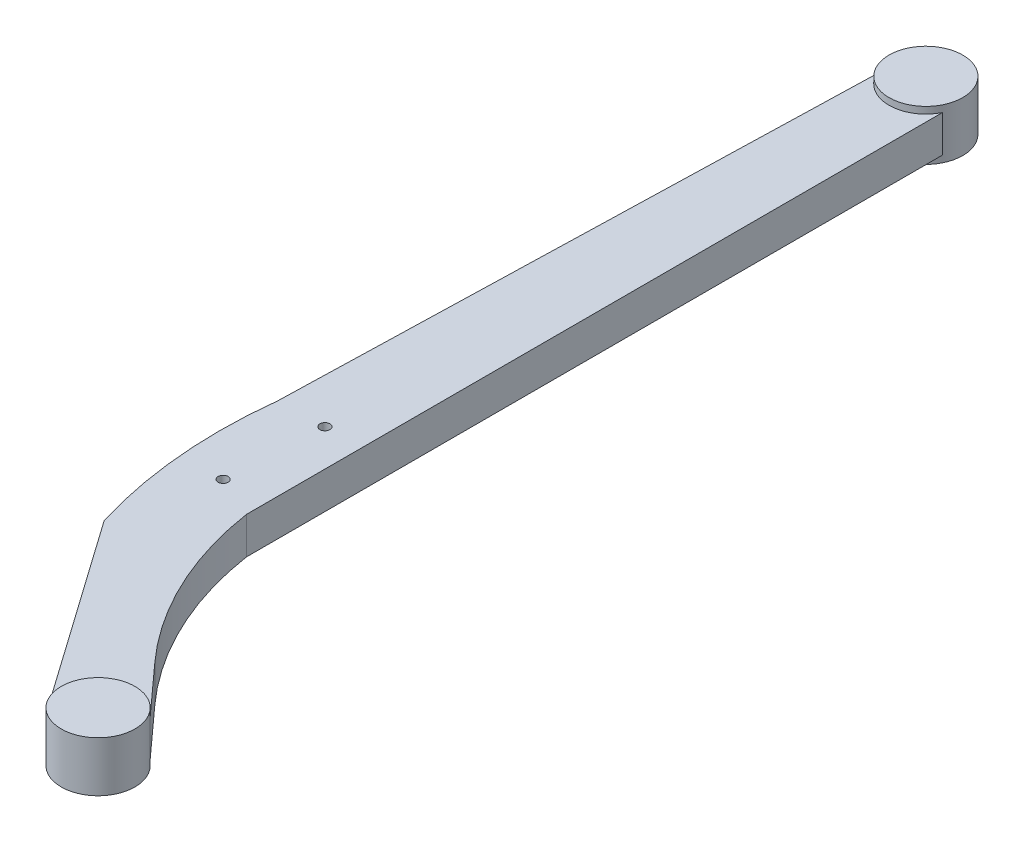
ISO-10303-21;
HEADER;
FILE_DESCRIPTION(('STEP AP214'),'2;1');
FILE_NAME('part.step','',(''),(''),'','','');
FILE_SCHEMA(('AUTOMOTIVE_DESIGN { 1 0 10303 214 1 1 1 1 }'));
ENDSEC;
DATA;
#1=APPLICATION_CONTEXT('core data for automotive mechanical design processes');
#2=APPLICATION_PROTOCOL_DEFINITION('international standard','automotive_design',2000,#1);
#3=PRODUCT_CONTEXT('',#1,'mechanical');
#4=PRODUCT('Part','Part','',(#3));
#5=PRODUCT_RELATED_PRODUCT_CATEGORY('part','',(#4));
#6=PRODUCT_DEFINITION_FORMATION('','',#4);
#7=PRODUCT_DEFINITION_CONTEXT('part definition',#1,'design');
#8=PRODUCT_DEFINITION('design','',#6,#7);
#9=PRODUCT_DEFINITION_SHAPE('','',#8);
#10=(LENGTH_UNIT() NAMED_UNIT(*) SI_UNIT(.MILLI.,.METRE.));
#11=(NAMED_UNIT(*) PLANE_ANGLE_UNIT() SI_UNIT($,.RADIAN.));
#12=(NAMED_UNIT(*) SI_UNIT($,.STERADIAN.) SOLID_ANGLE_UNIT());
#13=UNCERTAINTY_MEASURE_WITH_UNIT(LENGTH_MEASURE(1.E-05),#10,'distance_accuracy_value','');
#14=(GEOMETRIC_REPRESENTATION_CONTEXT(3) GLOBAL_UNCERTAINTY_ASSIGNED_CONTEXT((#13)) GLOBAL_UNIT_ASSIGNED_CONTEXT((#10,
#11,#12)) REPRESENTATION_CONTEXT('',''));
#15=CARTESIAN_POINT('',(0.,0.,0.));
#16=DIRECTION('',(0.,0.,1.));
#17=DIRECTION('',(1.,0.,0.));
#18=AXIS2_PLACEMENT_3D('',#15,#16,#17);
#19=CARTESIAN_POINT('',(494.329998611033,55.,65.8860398038322));
#20=DIRECTION('',(0.,-1.,0.));
#21=DIRECTION('',(0.,0.,-1.));
#22=AXIS2_PLACEMENT_3D('',#19,#20,#21);
#23=CYLINDRICAL_SURFACE('',#22,500.);
#24=CARTESIAN_POINT('',(494.329998611033,0.,65.8860398038322));
#25=DIRECTION('',(0.,-1.,0.));
#26=DIRECTION('',(0.,0.,-1.));
#27=AXIS2_PLACEMENT_3D('',#24,#25,#26);
#28=CIRCLE('',#27,500.);
#29=CARTESIAN_POINT('',(123.733893043613,0.,401.532470647752));
#30=VERTEX_POINT('',#29);
#31=CARTESIAN_POINT('',(0.,0.,140.971674070421));
#32=VERTEX_POINT('',#31);
#33=EDGE_CURVE('E136',#30,#32,#28,.T.);
#34=ORIENTED_EDGE('',*,*,#33,.T.);
#35=DIRECTION('',(0.,-1.,0.));
#36=VECTOR('',#35,1.);
#37=CARTESIAN_POINT('',(0.,55.,140.971674070421));
#38=LINE('',#37,#36);
#39=CARTESIAN_POINT('',(0.,55.,140.971674070421));
#40=VERTEX_POINT('',#39);
#41=EDGE_CURVE('E170',#40,#32,#38,.T.);
#42=ORIENTED_EDGE('',*,*,#41,.F.);
#43=CARTESIAN_POINT('',(494.329998611033,55.,65.8860398038322));
#44=DIRECTION('',(0.,-1.,0.));
#45=DIRECTION('',(0.,0.,-1.));
#46=AXIS2_PLACEMENT_3D('',#43,#44,#45);
#47=CIRCLE('',#46,500.);
#48=CARTESIAN_POINT('',(123.733893043613,55.,401.532470647752));
#49=VERTEX_POINT('',#48);
#50=EDGE_CURVE('E137',#49,#40,#47,.T.);
#51=ORIENTED_EDGE('',*,*,#50,.F.);
#52=DIRECTION('',(0.,-1.,0.));
#53=VECTOR('',#52,1.);
#54=CARTESIAN_POINT('',(123.733893043613,55.,401.532470647752));
#55=LINE('',#54,#53);
#56=EDGE_CURVE('E151',#49,#30,#55,.T.);
#57=ORIENTED_EDGE('',*,*,#56,.T.);
#58=EDGE_LOOP('',(#34,#42,#51,#57));
#59=FACE_BOUND('',#58,.T.);
#60=ADVANCED_FACE('F38',(#59),#23,.F.);
#61=CARTESIAN_POINT('',(0.,55.,140.971674070421));
#62=DIRECTION('',(-1.,0.,0.));
#63=DIRECTION('',(0.,0.,1.));
#64=AXIS2_PLACEMENT_3D('',#61,#62,#63);
#65=PLANE('',#64);
#66=DIRECTION('',(0.,0.,-1.));
#67=VECTOR('',#66,1.);
#68=CARTESIAN_POINT('',(0.,0.,140.971674070421));
#69=LINE('',#68,#67);
#70=CARTESIAN_POINT('',(0.,0.,-897.179223240032));
#71=VERTEX_POINT('',#70);
#72=EDGE_CURVE('E112',#32,#71,#69,.T.);
#73=ORIENTED_EDGE('',*,*,#72,.T.);
#74=DIRECTION('',(0.,1.,0.));
#75=VECTOR('',#74,1.);
#76=CARTESIAN_POINT('',(0.,-10.,-897.179223240032));
#77=LINE('',#76,#75);
#78=CARTESIAN_POINT('',(0.,55.,-897.179223240032));
#79=VERTEX_POINT('',#78);
#80=EDGE_CURVE('E62',#71,#79,#77,.T.);
#81=ORIENTED_EDGE('',*,*,#80,.T.);
#82=DIRECTION('',(0.,0.,-1.));
#83=VECTOR('',#82,1.);
#84=CARTESIAN_POINT('',(0.,55.,140.971674070421));
#85=LINE('',#84,#83);
#86=EDGE_CURVE('E140',#40,#79,#85,.T.);
#87=ORIENTED_EDGE('',*,*,#86,.F.);
#88=ORIENTED_EDGE('',*,*,#41,.T.);
#89=EDGE_LOOP('',(#73,#81,#87,#88));
#90=FACE_BOUND('',#89,.T.);
#91=ADVANCED_FACE('F209',(#90),#65,.F.);
#92=CARTESIAN_POINT('',(-98.3803973640586,55.,-921.782563534034));
#93=DIRECTION('',(0.999607961812172,0.,0.0279986192822836));
#94=DIRECTION('',(0.0279986192822836,0.,-0.999607961812173));
#95=AXIS2_PLACEMENT_3D('',#92,#93,#94);
#96=PLANE('',#95);
#97=DIRECTION('',(-0.0279986192822836,0.,0.999607961812172));
#98=VECTOR('',#97,1.);
#99=CARTESIAN_POINT('',(-98.3803973640586,55.,-921.782563534034));
#100=LINE('',#99,#98);
#101=CARTESIAN_POINT('',(-99.0317740672282,55.,-898.527083252571));
#102=VERTEX_POINT('',#101);
#103=CARTESIAN_POINT('',(-123.405755698307,55.,-28.3260974879873));
#104=VERTEX_POINT('',#103);
#105=EDGE_CURVE('E117',#102,#104,#100,.T.);
#106=ORIENTED_EDGE('',*,*,#105,.F.);
#107=DIRECTION('',(0.,1.,0.));
#108=VECTOR('',#107,1.);
#109=CARTESIAN_POINT('',(-99.0317740672282,-10.,-898.527083252571));
#110=LINE('',#109,#108);
#111=CARTESIAN_POINT('',(-99.0317740672282,0.,-898.527083252571));
#112=VERTEX_POINT('',#111);
#113=EDGE_CURVE('E115',#102,#112,#110,.F.);
#114=ORIENTED_EDGE('',*,*,#113,.T.);
#115=DIRECTION('',(-0.0279986192822836,0.,0.999607961812172));
#116=VECTOR('',#115,1.);
#117=CARTESIAN_POINT('',(-98.3803973640586,0.,-921.782563534034));
#118=LINE('',#117,#116);
#119=CARTESIAN_POINT('',(-123.405755698307,0.,-28.3260974879873));
#120=VERTEX_POINT('',#119);
#121=EDGE_CURVE('E104',#112,#120,#118,.T.);
#122=ORIENTED_EDGE('',*,*,#121,.T.);
#123=DIRECTION('',(0.,-1.,0.));
#124=VECTOR('',#123,1.);
#125=CARTESIAN_POINT('',(-123.405755698307,55.,-28.3260974879873));
#126=LINE('',#125,#124);
#127=EDGE_CURVE('E168',#104,#120,#126,.T.);
#128=ORIENTED_EDGE('',*,*,#127,.F.);
#129=EDGE_LOOP('',(#106,#114,#122,#128));
#130=FACE_BOUND('',#129,.T.);
#131=ADVANCED_FACE('F116',(#130),#96,.F.);
#132=CARTESIAN_POINT('',(571.730195794723,55.,52.9021173441669));
#133=DIRECTION('',(0.,-1.,0.));
#134=DIRECTION('',(0.,0.,-1.));
#135=AXIS2_PLACEMENT_3D('',#132,#133,#134);
#136=CYLINDRICAL_SURFACE('',#135,699.86571136393);
#137=CARTESIAN_POINT('',(571.730195794723,0.,52.9021173441669));
#138=DIRECTION('',(0.,1.,0.));
#139=DIRECTION('',(0.,0.,-1.));
#140=AXIS2_PLACEMENT_3D('',#137,#138,#139);
#141=CIRCLE('',#140,699.86571136393);
#142=CARTESIAN_POINT('',(-98.3803973640586,0.,254.802604910011));
#143=VERTEX_POINT('',#142);
#144=EDGE_CURVE('E108',#120,#143,#141,.T.);
#145=ORIENTED_EDGE('',*,*,#144,.T.);
#146=DIRECTION('',(0.,-1.,0.));
#147=VECTOR('',#146,1.);
#148=CARTESIAN_POINT('',(-98.3803973640586,55.,254.802604910011));
#149=LINE('',#148,#147);
#150=CARTESIAN_POINT('',(-98.3803973640586,55.,254.802604910011));
#151=VERTEX_POINT('',#150);
#152=EDGE_CURVE('E165',#151,#143,#149,.T.);
#153=ORIENTED_EDGE('',*,*,#152,.F.);
#154=CARTESIAN_POINT('',(571.730195794723,55.,52.9021173441669));
#155=DIRECTION('',(0.,1.,0.));
#156=DIRECTION('',(0.,0.,-1.));
#157=AXIS2_PLACEMENT_3D('',#154,#155,#156);
#158=CIRCLE('',#157,699.86571136393);
#159=EDGE_CURVE('E144',#104,#151,#158,.T.);
#160=ORIENTED_EDGE('',*,*,#159,.F.);
#161=ORIENTED_EDGE('',*,*,#127,.T.);
#162=EDGE_LOOP('',(#145,#153,#160,#161));
#163=FACE_BOUND('',#162,.T.);
#164=ADVANCED_FACE('F233',(#163),#136,.T.);
#165=CARTESIAN_POINT('',(108.641172318948,55.,548.724400701999));
#166=DIRECTION('',(0.817560605638522,0.,-0.575842561910782));
#167=DIRECTION('',(-0.575842561910782,0.,-0.817560605638522));
#168=AXIS2_PLACEMENT_3D('',#165,#166,#167);
#169=PLANE('',#168);
#170=DIRECTION('',(0.575842561910782,0.,0.817560605638522));
#171=VECTOR('',#170,1.);
#172=CARTESIAN_POINT('',(108.641172318948,0.,548.724400701999));
#173=LINE('',#172,#171);
#174=CARTESIAN_POINT('',(100.344151391915,0.,536.944588123381));
#175=VERTEX_POINT('',#174);
#176=EDGE_CURVE('E156',#143,#175,#173,.T.);
#177=ORIENTED_EDGE('',*,*,#176,.T.);
#178=DIRECTION('',(0.,1.,0.));
#179=VECTOR('',#178,1.);
#180=CARTESIAN_POINT('',(100.344151391915,-10.,536.944588123381));
#181=LINE('',#180,#179);
#182=CARTESIAN_POINT('',(100.344151391915,55.,536.944588123381));
#183=VERTEX_POINT('',#182);
#184=EDGE_CURVE('E132',#175,#183,#181,.T.);
#185=ORIENTED_EDGE('',*,*,#184,.T.);
#186=DIRECTION('',(0.575842561910782,0.,0.817560605638522));
#187=VECTOR('',#186,1.);
#188=CARTESIAN_POINT('',(108.641172318948,55.,548.724400701999));
#189=LINE('',#188,#187);
#190=EDGE_CURVE('E146',#151,#183,#189,.T.);
#191=ORIENTED_EDGE('',*,*,#190,.F.);
#192=ORIENTED_EDGE('',*,*,#152,.T.);
#193=EDGE_LOOP('',(#177,#185,#191,#192));
#194=FACE_BOUND('',#193,.T.);
#195=ADVANCED_FACE('F228',(#194),#169,.F.);
#196=CARTESIAN_POINT('',(189.500983304597,55.,474.147655215453));
#197=DIRECTION('',(-0.741192211134837,0.,0.671292861687841));
#198=DIRECTION('',(0.671292861687841,0.,0.741192211134837));
#199=AXIS2_PLACEMENT_3D('',#196,#197,#198);
#200=PLANE('',#199);
#201=DIRECTION('',(-0.671292861687841,0.,-0.741192211134837));
#202=VECTOR('',#201,1.);
#203=CARTESIAN_POINT('',(189.500983304597,0.,474.147655215453));
#204=LINE('',#203,#202);
#205=CARTESIAN_POINT('',(189.500983304595,0.,474.14765521545));
#206=VERTEX_POINT('',#205);
#207=EDGE_CURVE('E141',#206,#30,#204,.T.);
#208=ORIENTED_EDGE('',*,*,#207,.T.);
#209=ORIENTED_EDGE('',*,*,#56,.F.);
#210=DIRECTION('',(-0.671292861687841,0.,-0.741192211134837));
#211=VECTOR('',#210,1.);
#212=CARTESIAN_POINT('',(189.500983304597,55.,474.147655215453));
#213=LINE('',#212,#211);
#214=CARTESIAN_POINT('',(189.500983304597,55.,474.147655215453));
#215=VERTEX_POINT('',#214);
#216=EDGE_CURVE('E149',#215,#49,#213,.T.);
#217=ORIENTED_EDGE('',*,*,#216,.F.);
#218=DIRECTION('',(0.,-1.,0.));
#219=VECTOR('',#218,1.);
#220=CARTESIAN_POINT('',(189.500983304597,55.,474.147655215453));
#221=LINE('',#220,#219);
#222=EDGE_CURVE('E162',#215,#206,#221,.T.);
#223=ORIENTED_EDGE('',*,*,#222,.T.);
#224=EDGE_LOOP('',(#208,#209,#217,#223));
#225=FACE_BOUND('',#224,.T.);
#226=ADVANCED_FACE('F223',(#225),#200,.F.);
#227=CARTESIAN_POINT('',(494.329998611033,55.,65.8860398038322));
#228=DIRECTION('',(0.,-1.,0.));
#229=DIRECTION('',(0.,0.,-1.));
#230=AXIS2_PLACEMENT_3D('',#227,#228,#229);
#231=PLANE('',#230);
#232=CARTESIAN_POINT('',(-54.7352427235559,55.,-30.7640708075219));
#233=DIRECTION('',(0.,1.,0.));
#234=DIRECTION('',(0.,0.,1.));
#235=AXIS2_PLACEMENT_3D('',#232,#233,#234);
#236=CIRCLE('',#235,7.52228910430885);
#237=CARTESIAN_POINT('',(-54.7352427235559,55.,-23.241781703213));
#238=VERTEX_POINT('',#237);
#239=EDGE_CURVE('E176',#238,#238,#236,.T.);
#240=ORIENTED_EDGE('',*,*,#239,.F.);
#241=EDGE_LOOP('',(#240));
#242=FACE_BOUND('',#241,.T.);
#243=CARTESIAN_POINT('',(-62.6232867921132,55.,113.19562724689));
#244=DIRECTION('',(0.,1.,0.));
#245=DIRECTION('',(0.,0.,1.));
#246=AXIS2_PLACEMENT_3D('',#243,#244,#245);
#247=CIRCLE('',#246,7.52228910430885);
#248=CARTESIAN_POINT('',(-62.6232867921132,55.,120.717916351199));
#249=VERTEX_POINT('',#248);
#250=EDGE_CURVE('E182',#249,#249,#247,.T.);
#251=ORIENTED_EDGE('',*,*,#250,.F.);
#252=EDGE_LOOP('',(#251));
#253=FACE_BOUND('',#252,.T.);
#254=ORIENTED_EDGE('',*,*,#86,.T.);
#255=CARTESIAN_POINT('',(-49.1901986820293,55.,-921.782563534034));
#256=DIRECTION('',(0.,-1.,0.));
#257=DIRECTION('',(0.,0.,-1.));
#258=AXIS2_PLACEMENT_3D('',#255,#256,#257);
#259=CIRCLE('',#258,55.);
#260=EDGE_CURVE('E54',#79,#102,#259,.T.);
#261=ORIENTED_EDGE('',*,*,#260,.T.);
#262=ORIENTED_EDGE('',*,*,#105,.T.);
#263=ORIENTED_EDGE('',*,*,#159,.T.);
#264=ORIENTED_EDGE('',*,*,#190,.T.);
#265=CARTESIAN_POINT('',(149.071077811772,55.,511.436027958726));
#266=DIRECTION('',(0.,-1.,0.));
#267=DIRECTION('',(0.,0.,-1.));
#268=AXIS2_PLACEMENT_3D('',#265,#266,#267);
#269=CIRCLE('',#268,55.);
#270=EDGE_CURVE('E134',#183,#215,#269,.T.);
#271=ORIENTED_EDGE('',*,*,#270,.T.);
#272=ORIENTED_EDGE('',*,*,#216,.T.);
#273=ORIENTED_EDGE('',*,*,#50,.T.);
#274=EDGE_LOOP('',(#254,#261,#262,#263,#264,#271,#272,#273));
#275=FACE_BOUND('',#274,.T.);
#276=ADVANCED_FACE('F218',(#242,#253,#275),#231,.F.);
#277=CARTESIAN_POINT('',(494.329998611033,0.,65.8860398038322));
#278=DIRECTION('',(0.,-1.,0.));
#279=DIRECTION('',(0.,0.,-1.));
#280=AXIS2_PLACEMENT_3D('',#277,#278,#279);
#281=PLANE('',#280);
#282=CARTESIAN_POINT('',(-54.7352427235559,0.,-30.7640708075219));
#283=DIRECTION('',(0.,-1.,0.));
#284=DIRECTION('',(0.,0.,-1.));
#285=AXIS2_PLACEMENT_3D('',#282,#283,#284);
#286=CIRCLE('',#285,7.52228910430885);
#287=CARTESIAN_POINT('',(-54.7352427235559,0.,-38.2863599118307));
#288=VERTEX_POINT('',#287);
#289=EDGE_CURVE('E41',#288,#288,#286,.T.);
#290=ORIENTED_EDGE('',*,*,#289,.F.);
#291=EDGE_LOOP('',(#290));
#292=FACE_BOUND('',#291,.T.);
#293=CARTESIAN_POINT('',(-62.6232867921132,0.,113.19562724689));
#294=DIRECTION('',(0.,-1.,0.));
#295=DIRECTION('',(0.,0.,-1.));
#296=AXIS2_PLACEMENT_3D('',#293,#294,#295);
#297=CIRCLE('',#296,7.52228910430885);
#298=CARTESIAN_POINT('',(-62.6232867921132,0.,105.673338142581));
#299=VERTEX_POINT('',#298);
#300=EDGE_CURVE('E174',#299,#299,#297,.T.);
#301=ORIENTED_EDGE('',*,*,#300,.F.);
#302=EDGE_LOOP('',(#301));
#303=FACE_BOUND('',#302,.T.);
#304=CARTESIAN_POINT('',(-49.1901986820293,0.,-921.782563534034));
#305=DIRECTION('',(0.,-1.,0.));
#306=DIRECTION('',(0.,0.,-1.));
#307=AXIS2_PLACEMENT_3D('',#304,#305,#306);
#308=CIRCLE('',#307,55.);
#309=EDGE_CURVE('E11',#71,#112,#308,.T.);
#310=ORIENTED_EDGE('',*,*,#309,.F.);
#311=ORIENTED_EDGE('',*,*,#72,.F.);
#312=ORIENTED_EDGE('',*,*,#33,.F.);
#313=ORIENTED_EDGE('',*,*,#207,.F.);
#314=CARTESIAN_POINT('',(149.071077811772,0.,511.436027958726));
#315=DIRECTION('',(0.,-1.,0.));
#316=DIRECTION('',(0.,0.,-1.));
#317=AXIS2_PLACEMENT_3D('',#314,#315,#316);
#318=CIRCLE('',#317,55.);
#319=EDGE_CURVE('E46',#175,#206,#318,.T.);
#320=ORIENTED_EDGE('',*,*,#319,.F.);
#321=ORIENTED_EDGE('',*,*,#176,.F.);
#322=ORIENTED_EDGE('',*,*,#144,.F.);
#323=ORIENTED_EDGE('',*,*,#121,.F.);
#324=EDGE_LOOP('',(#310,#311,#312,#313,#320,#321,#322,#323));
#325=FACE_BOUND('',#324,.T.);
#326=ADVANCED_FACE('F106',(#292,#303,#325),#281,.T.);
#327=CARTESIAN_POINT('',(149.071077811772,-10.,511.436027958726));
#328=DIRECTION('',(0.,1.,0.));
#329=DIRECTION('',(0.,0.,1.));
#330=AXIS2_PLACEMENT_3D('',#327,#328,#329);
#331=CYLINDRICAL_SURFACE('',#330,55.);
#332=CARTESIAN_POINT('',(149.071077811772,65.,511.436027958726));
#333=DIRECTION('',(0.,1.,0.));
#334=DIRECTION('',(0.,0.,1.));
#335=AXIS2_PLACEMENT_3D('',#332,#333,#334);
#336=CIRCLE('',#335,55.);
#337=CARTESIAN_POINT('',(149.071077811772,65.,566.436027958726));
#338=VERTEX_POINT('',#337);
#339=EDGE_CURVE('E123',#338,#338,#336,.T.);
#340=ORIENTED_EDGE('',*,*,#339,.F.);
#341=EDGE_LOOP('',(#340));
#342=FACE_BOUND('',#341,.T.);
#343=CARTESIAN_POINT('',(149.071077811772,-10.,511.436027958726));
#344=DIRECTION('',(0.,1.,0.));
#345=DIRECTION('',(0.,0.,1.));
#346=AXIS2_PLACEMENT_3D('',#343,#344,#345);
#347=CIRCLE('',#346,55.);
#348=CARTESIAN_POINT('',(149.071077811772,-10.,566.436027958726));
#349=VERTEX_POINT('',#348);
#350=EDGE_CURVE('E129',#349,#349,#347,.T.);
#351=ORIENTED_EDGE('',*,*,#350,.T.);
#352=EDGE_LOOP('',(#351));
#353=FACE_BOUND('',#352,.T.);
#354=ORIENTED_EDGE('',*,*,#270,.F.);
#355=ORIENTED_EDGE('',*,*,#184,.F.);
#356=ORIENTED_EDGE('',*,*,#319,.T.);
#357=ORIENTED_EDGE('',*,*,#222,.F.);
#358=EDGE_LOOP('',(#354,#355,#356,#357));
#359=FACE_BOUND('',#358,.T.);
#360=ADVANCED_FACE('F226',(#342,#353,#359),#331,.T.);
#361=CARTESIAN_POINT('',(149.071077811772,-10.,511.436027958726));
#362=DIRECTION('',(0.,1.,0.));
#363=DIRECTION('',(0.,0.,1.));
#364=AXIS2_PLACEMENT_3D('',#361,#362,#363);
#365=PLANE('',#364);
#366=ORIENTED_EDGE('',*,*,#350,.F.);
#367=EDGE_LOOP('',(#366));
#368=FACE_BOUND('',#367,.T.);
#369=ADVANCED_FACE('F253',(#368),#365,.F.);
#370=CARTESIAN_POINT('',(149.071077811772,65.,511.436027958726));
#371=DIRECTION('',(0.,1.,0.));
#372=DIRECTION('',(0.,0.,1.));
#373=AXIS2_PLACEMENT_3D('',#370,#371,#372);
#374=PLANE('',#373);
#375=ORIENTED_EDGE('',*,*,#339,.T.);
#376=EDGE_LOOP('',(#375));
#377=FACE_BOUND('',#376,.T.);
#378=ADVANCED_FACE('F205',(#377),#374,.T.);
#379=CARTESIAN_POINT('',(-49.1901986820293,-10.,-921.782563534034));
#380=DIRECTION('',(0.,1.,0.));
#381=DIRECTION('',(0.,0.,1.));
#382=AXIS2_PLACEMENT_3D('',#379,#380,#381);
#383=CYLINDRICAL_SURFACE('',#382,55.);
#384=CARTESIAN_POINT('',(-49.1901986820293,65.,-921.782563534034));
#385=DIRECTION('',(0.,1.,0.));
#386=DIRECTION('',(0.,0.,1.));
#387=AXIS2_PLACEMENT_3D('',#384,#385,#386);
#388=CIRCLE('',#387,55.);
#389=CARTESIAN_POINT('',(-49.1901986820293,65.,-866.782563534034));
#390=VERTEX_POINT('',#389);
#391=EDGE_CURVE('E180',#390,#390,#388,.T.);
#392=ORIENTED_EDGE('',*,*,#391,.F.);
#393=EDGE_LOOP('',(#392));
#394=FACE_BOUND('',#393,.T.);
#395=CARTESIAN_POINT('',(-49.1901986820293,-10.,-921.782563534034));
#396=DIRECTION('',(0.,1.,0.));
#397=DIRECTION('',(0.,0.,1.));
#398=AXIS2_PLACEMENT_3D('',#395,#396,#397);
#399=CIRCLE('',#398,55.);
#400=CARTESIAN_POINT('',(-49.1901986820293,-10.,-866.782563534034));
#401=VERTEX_POINT('',#400);
#402=EDGE_CURVE('E119',#401,#401,#399,.T.);
#403=ORIENTED_EDGE('',*,*,#402,.T.);
#404=EDGE_LOOP('',(#403));
#405=FACE_BOUND('',#404,.T.);
#406=ORIENTED_EDGE('',*,*,#260,.F.);
#407=ORIENTED_EDGE('',*,*,#80,.F.);
#408=ORIENTED_EDGE('',*,*,#309,.T.);
#409=ORIENTED_EDGE('',*,*,#113,.F.);
#410=EDGE_LOOP('',(#406,#407,#408,#409));
#411=FACE_BOUND('',#410,.T.);
#412=ADVANCED_FACE('F121',(#394,#405,#411),#383,.T.);
#413=CARTESIAN_POINT('',(-49.1901986820293,-10.,-921.782563534034));
#414=DIRECTION('',(0.,1.,0.));
#415=DIRECTION('',(0.,0.,1.));
#416=AXIS2_PLACEMENT_3D('',#413,#414,#415);
#417=PLANE('',#416);
#418=ORIENTED_EDGE('',*,*,#402,.F.);
#419=EDGE_LOOP('',(#418));
#420=FACE_BOUND('',#419,.T.);
#421=ADVANCED_FACE('F194',(#420),#417,.F.);
#422=CARTESIAN_POINT('',(-49.1901986820293,65.,-921.782563534034));
#423=DIRECTION('',(0.,1.,0.));
#424=DIRECTION('',(0.,0.,1.));
#425=AXIS2_PLACEMENT_3D('',#422,#423,#424);
#426=PLANE('',#425);
#427=ORIENTED_EDGE('',*,*,#391,.T.);
#428=EDGE_LOOP('',(#427));
#429=FACE_BOUND('',#428,.T.);
#430=ADVANCED_FACE('F196',(#429),#426,.T.);
#431=CARTESIAN_POINT('',(-62.6232867921132,-10.,113.19562724689));
#432=DIRECTION('',(0.,1.,0.));
#433=DIRECTION('',(0.,0.,1.));
#434=AXIS2_PLACEMENT_3D('',#431,#432,#433);
#435=CYLINDRICAL_SURFACE('',#434,7.52228910430885);
#436=ORIENTED_EDGE('',*,*,#300,.T.);
#437=EDGE_LOOP('',(#436));
#438=FACE_BOUND('',#437,.T.);
#439=ORIENTED_EDGE('',*,*,#250,.T.);
#440=EDGE_LOOP('',(#439));
#441=FACE_BOUND('',#440,.T.);
#442=ADVANCED_FACE('F202',(#438,#441),#435,.F.);
#443=CARTESIAN_POINT('',(-54.7352427235559,-10.,-30.7640708075219));
#444=DIRECTION('',(0.,1.,0.));
#445=DIRECTION('',(0.,0.,1.));
#446=AXIS2_PLACEMENT_3D('',#443,#444,#445);
#447=CYLINDRICAL_SURFACE('',#446,7.52228910430885);
#448=ORIENTED_EDGE('',*,*,#289,.T.);
#449=EDGE_LOOP('',(#448));
#450=FACE_BOUND('',#449,.T.);
#451=ORIENTED_EDGE('',*,*,#239,.T.);
#452=EDGE_LOOP('',(#451));
#453=FACE_BOUND('',#452,.T.);
#454=ADVANCED_FACE('F309',(#450,#453),#447,.F.);
#455=CLOSED_SHELL('',(#60,#91,#131,#164,#195,#226,#276,#326,#360,#369,#378,#412,#421,#430,#442,#454));
#456=MANIFOLD_SOLID_BREP('B2',#455);
#457=ADVANCED_BREP_SHAPE_REPRESENTATION('',(#18,#456),#14);
#458=SHAPE_DEFINITION_REPRESENTATION(#9,#457);
ENDSEC;
END-ISO-10303-21;
